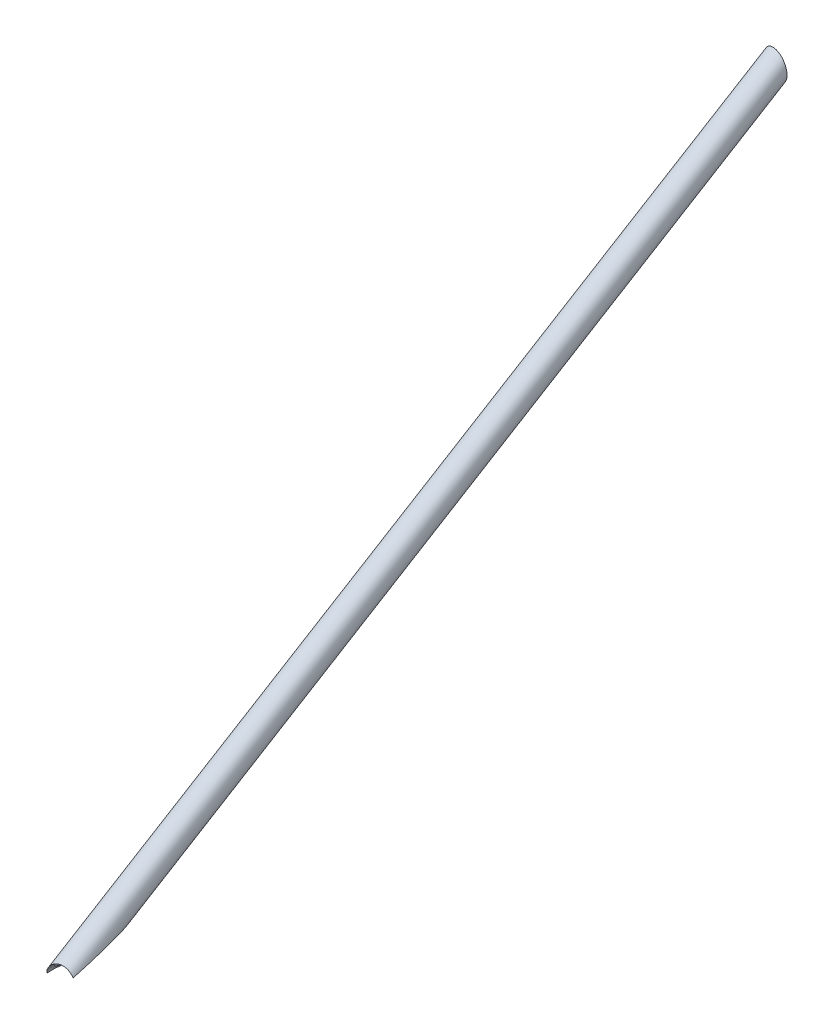
ISO-10303-21;
HEADER;
FILE_DESCRIPTION(('STEP AP214'),'2;1');
FILE_NAME('part.step','',(''),(''),'','','');
FILE_SCHEMA(('AUTOMOTIVE_DESIGN { 1 0 10303 214 1 1 1 1 }'));
ENDSEC;
DATA;
#1=APPLICATION_CONTEXT('core data for automotive mechanical design processes');
#2=APPLICATION_PROTOCOL_DEFINITION('international standard','automotive_design',2000,#1);
#3=PRODUCT_CONTEXT('',#1,'mechanical');
#4=PRODUCT('Part','Part','',(#3));
#5=PRODUCT_RELATED_PRODUCT_CATEGORY('part','',(#4));
#6=PRODUCT_DEFINITION_FORMATION('','',#4);
#7=PRODUCT_DEFINITION_CONTEXT('part definition',#1,'design');
#8=PRODUCT_DEFINITION('design','',#6,#7);
#9=PRODUCT_DEFINITION_SHAPE('','',#8);
#10=(LENGTH_UNIT() NAMED_UNIT(*) SI_UNIT(.MILLI.,.METRE.));
#11=(NAMED_UNIT(*) PLANE_ANGLE_UNIT() SI_UNIT($,.RADIAN.));
#12=(NAMED_UNIT(*) SI_UNIT($,.STERADIAN.) SOLID_ANGLE_UNIT());
#13=UNCERTAINTY_MEASURE_WITH_UNIT(LENGTH_MEASURE(1.E-05),#10,'distance_accuracy_value','');
#14=(GEOMETRIC_REPRESENTATION_CONTEXT(3) GLOBAL_UNCERTAINTY_ASSIGNED_CONTEXT((#13)) GLOBAL_UNIT_ASSIGNED_CONTEXT((#10,
#11,#12)) REPRESENTATION_CONTEXT('',''));
#15=CARTESIAN_POINT('',(0.,0.,0.));
#16=DIRECTION('',(0.,0.,1.));
#17=DIRECTION('',(1.,0.,0.));
#18=AXIS2_PLACEMENT_3D('',#15,#16,#17);
#19=CARTESIAN_POINT('',(150.,500.,-1140.));
#20=DIRECTION('',(0.0991899501072693,-0.396759800429077,0.912547540986877));
#21=DIRECTION('',(0.,-0.917070056253235,-0.39872611141445));
#22=AXIS2_PLACEMENT_3D('',#19,#20,#21);
#23=CYLINDRICAL_SURFACE('',#22,9.39999999999998);
#24=CARTESIAN_POINT('',(150.,500.,-1140.));
#25=DIRECTION('',(0.136924020573454,0.0230393226257371,-0.990313587810925));
#26=DIRECTION('',(0.508281006832032,-0.859722512143854,0.0502754433782237));
#27=AXIS2_PLACEMENT_3D('',#24,#25,#26);
#28=ELLIPSE('',#27,10.4529482704683,9.39999999999998);
#29=CARTESIAN_POINT('',(155.313035071277,491.013365053603,-1139.47447339109));
#30=VERTEX_POINT('',#29);
#31=EDGE_CURVE('E109',#30,#30,#28,.T.);
#32=ORIENTED_EDGE('',*,*,#31,.T.);
#33=EDGE_LOOP('',(#32));
#34=FACE_BOUND('',#33,.T.);
#35=CARTESIAN_POINT('',(220.064661909303,211.120893834006,-499.153135881705));
#36=CARTESIAN_POINT('',(220.099320079411,211.171386992194,-499.269269018708));
#37=CARTESIAN_POINT('',(220.134469333474,211.222149182262,-499.385137770033));
#38=CARTESIAN_POINT('',(220.205820504916,211.324244067555,-499.616300759155));
#39=CARTESIAN_POINT('',(220.242022438906,211.375576771776,-499.731594987853));
#40=CARTESIAN_POINT('',(220.352324937469,211.530493509359,-500.076574131023));
#41=CARTESIAN_POINT('',(220.428111647901,211.634980752581,-500.305319973177));
#42=CARTESIAN_POINT('',(220.584947604145,211.846759567912,-500.759972038414));
#43=CARTESIAN_POINT('',(220.666001544587,211.954053589355,-500.985875508033));
#44=CARTESIAN_POINT('',(220.834207488277,212.171729349294,-501.433871553911));
#45=CARTESIAN_POINT('',(220.92135872542,212.282110698835,-501.655964604585));
#46=CARTESIAN_POINT('',(221.102029020127,212.505311366507,-502.09305726484));
#47=CARTESIAN_POINT('',(221.195473215947,212.618093847434,-502.308106383438));
#48=CARTESIAN_POINT('',(221.391076842564,212.847785737646,-502.731946943887));
#49=CARTESIAN_POINT('',(221.493234757017,212.964694426829,-502.940739465986));
#50=CARTESIAN_POINT('',(221.708662818101,213.203666180425,-503.35009593615));
#51=CARTESIAN_POINT('',(221.821951727775,213.325737743401,-503.550645153088));
#52=CARTESIAN_POINT('',(222.062593133385,213.575818127842,-503.939146104218));
#53=CARTESIAN_POINT('',(222.189929152756,213.703819893327,-504.127112190407));
#54=CARTESIAN_POINT('',(222.395929897975,213.90205113745,-504.395402294217));
#55=CARTESIAN_POINT('',(222.46759295385,213.969609163335,-504.483060630941));
#56=CARTESIAN_POINT('',(222.616575584827,214.106697559118,-504.651734317474));
#57=CARTESIAN_POINT('',(222.693891782484,214.176226736399,-504.732753573389));
#58=CARTESIAN_POINT('',(222.854644965282,214.316910495059,-504.885584985316));
#59=CARTESIAN_POINT('',(222.938041633431,214.388052538127,-504.957450410004));
#60=CARTESIAN_POINT('',(223.112183975867,214.532098428571,-505.089399004768));
#61=CARTESIAN_POINT('',(223.202917028092,214.604999104741,-505.149501827237));
#62=CARTESIAN_POINT('',(223.380751717223,214.742915202468,-505.24737182625));
#63=CARTESIAN_POINT('',(223.466924635979,214.807796153569,-505.28697807314));
#64=CARTESIAN_POINT('',(223.645165882068,214.937366313044,-505.350345210875));
#65=CARTESIAN_POINT('',(223.737230611429,215.00205561367,-505.374115672899));
#66=CARTESIAN_POINT('',(223.926791003018,215.130086690554,-505.402385855141));
#67=CARTESIAN_POINT('',(224.024333113451,215.193407513742,-505.406683014352));
#68=CARTESIAN_POINT('',(224.220776672351,215.315427611468,-505.393311178749));
#69=CARTESIAN_POINT('',(224.319677064809,215.37413026129,-505.375658388106));
#70=CARTESIAN_POINT('',(224.504738725796,215.478918968777,-505.322395062764));
#71=CARTESIAN_POINT('',(224.591138344467,215.525682817421,-505.288888377496));
#72=CARTESIAN_POINT('',(224.760133247636,215.613211524775,-505.207575067726));
#73=CARTESIAN_POINT('',(224.842725294058,215.653971339849,-505.159756521744));
#74=CARTESIAN_POINT('',(225.047069682041,215.750314348958,-505.023403744513));
#75=CARTESIAN_POINT('',(225.165432621817,215.801753387983,-504.926928033842));
#76=CARTESIAN_POINT('',(225.390331010981,215.892664768235,-504.71621093246));
#77=CARTESIAN_POINT('',(225.496828882758,215.932099738527,-504.601915702968));
#78=CARTESIAN_POINT('',(225.696594209342,216.000524349176,-504.36520683162));
#79=CARTESIAN_POINT('',(225.790142050682,216.029768158182,-504.243097244514));
#80=CARTESIAN_POINT('',(225.969004569025,216.081189885288,-503.991502622916));
#81=CARTESIAN_POINT('',(226.054310664064,216.103360492328,-503.862010119095));
#82=CARTESIAN_POINT('',(226.218183105302,216.14209317163,-503.59765188341));
#83=CARTESIAN_POINT('',(226.296733287218,216.158642057603,-503.462774336563));
#84=CARTESIAN_POINT('',(226.447953132168,216.187123784577,-503.189412093623));
#85=CARTESIAN_POINT('',(226.5206256252,216.199058857633,-503.050929176419));
#86=CARTESIAN_POINT('',(226.716007742258,216.227016153202,-502.66179620998));
#87=CARTESIAN_POINT('',(226.833371638449,216.238928201088,-502.408172554985));
#88=CARTESIAN_POINT('',(227.056188274308,216.253920927869,-501.895435255878));
#89=CARTESIAN_POINT('',(227.161633393187,216.256995986795,-501.636318223656));
#90=CARTESIAN_POINT('',(227.36319475252,216.256303123197,-501.113909115738));
#91=CARTESIAN_POINT('',(227.459291366102,216.252521117826,-500.850609551166));
#92=CARTESIAN_POINT('',(227.643660986443,216.239478715106,-500.321413355495));
#93=CARTESIAN_POINT('',(227.731933064823,216.230217668668,-500.055516420363));
#94=CARTESIAN_POINT('',(227.902419455519,216.207138144898,-499.520238817643));
#95=CARTESIAN_POINT('',(227.984594287359,216.193292683817,-499.250846821768));
#96=CARTESIAN_POINT('',(228.143271419488,216.161805139958,-498.710612298831));
#97=CARTESIAN_POINT('',(228.219773417564,216.144162855104,-498.439769695312));
#98=CARTESIAN_POINT('',(228.367731976782,216.105680188694,-497.897393153289));
#99=CARTESIAN_POINT('',(228.439196141049,216.084844783911,-497.625860926399));
#100=CARTESIAN_POINT('',(228.577789296708,216.040398608003,-497.081933011295));
#101=CARTESIAN_POINT('',(228.644918428945,216.016787927119,-496.809537351435));
#102=CARTESIAN_POINT('',(228.788865859697,215.961987452383,-496.207360000409));
#103=CARTESIAN_POINT('',(228.864798364783,215.930242310439,-495.877417328371));
#104=CARTESIAN_POINT('',(229.011686568746,215.863716173058,-495.216728549147));
#105=CARTESIAN_POINT('',(229.08264212374,215.828935089916,-494.885982419019));
#106=CARTESIAN_POINT('',(229.288868650401,215.720642729472,-493.892709845382));
#107=CARTESIAN_POINT('',(229.417481594968,215.643189449449,-493.2292252314));
#108=CARTESIAN_POINT('',(229.660091347835,215.480125000602,-491.900247205637));
#109=CARTESIAN_POINT('',(229.774080027039,215.3945093403,-491.234752885282));
#110=CARTESIAN_POINT('',(229.989417484592,215.216835299838,-489.902569178675));
#111=CARTESIAN_POINT('',(230.090765859715,215.124776714295,-489.235879754987));
#112=CARTESIAN_POINT('',(230.282597688606,214.935191205951,-487.899307571728));
#113=CARTESIAN_POINT('',(230.373042031195,214.837646337381,-487.22942178249));
#114=CARTESIAN_POINT('',(230.543670517482,214.638446966581,-485.888950856504));
#115=CARTESIAN_POINT('',(230.623854513367,214.536792405174,-485.218365709821));
#116=CARTESIAN_POINT('',(230.774613905371,214.330338362139,-483.876888975044));
#117=CARTESIAN_POINT('',(230.845193231446,214.225540188338,-483.205997625666));
#118=CARTESIAN_POINT('',(230.977192865644,214.013603749743,-481.863690341685));
#119=CARTESIAN_POINT('',(231.038613231726,213.906465499762,-481.192274410429));
#120=CARTESIAN_POINT('',(231.152213257609,213.691142311586,-479.851847151599));
#121=CARTESIAN_POINT('',(231.204431959075,213.582963955358,-479.18283807156));
#122=CARTESIAN_POINT('',(231.299874457506,213.365949510461,-477.844279431712));
#123=CARTESIAN_POINT('',(231.343098187854,213.257113416925,-477.174729867936));
#124=CARTESIAN_POINT('',(231.420216514265,213.039664802256,-475.834722961952));
#125=CARTESIAN_POINT('',(231.454106609656,212.931052413958,-475.164265337916));
#126=CARTESIAN_POINT('',(231.511839622914,212.715193816297,-473.822706268846));
#127=CARTESIAN_POINT('',(231.535682733467,212.607947580772,-473.151604836408));
#128=CARTESIAN_POINT('',(231.572122617046,212.396501726966,-471.810903686558));
#129=CARTESIAN_POINT('',(231.584756671338,212.292293132642,-471.141306435786));
#130=CARTESIAN_POINT('',(231.597140949471,212.088225733161,-469.801259520993));
#131=CARTESIAN_POINT('',(231.596890069008,211.988367301568,-469.130809788834));
#132=CARTESIAN_POINT('',(231.580797535177,211.795294638263,-467.789600387438));
#133=CARTESIAN_POINT('',(231.564967605842,211.702075466737,-467.118841330385));
#134=CARTESIAN_POINT('',(231.526290906026,211.569490092793,-466.112382842278));
#135=CARTESIAN_POINT('',(231.510911837949,211.526505299738,-465.776869806133));
#136=CARTESIAN_POINT('',(231.474392711313,211.443450540988,-465.105801165664));
#137=CARTESIAN_POINT('',(231.453252918551,211.403380440919,-464.770245564018));
#138=CARTESIAN_POINT('',(231.41311622617,211.340604505092,-464.220646074328));
#139=CARTESIAN_POINT('',(231.396112415219,211.316862489423,-464.006574330762));
#140=CARTESIAN_POINT('',(231.359053707262,211.270977416602,-463.578515270828));
#141=CARTESIAN_POINT('',(231.33899872175,211.24883440586,-463.364527957089));
#142=CARTESIAN_POINT('',(231.295473104098,211.206334812159,-462.936646709144));
#143=CARTESIAN_POINT('',(231.272001358971,211.185978814786,-462.722752828233));
#144=CARTESIAN_POINT('',(231.221217559821,211.147279864333,-462.295247806794));
#145=CARTESIAN_POINT('',(231.193905532552,211.12893689723,-462.081636664307));
#146=CARTESIAN_POINT('',(231.105544738564,211.077308057867,-461.44176975567));
#147=CARTESIAN_POINT('',(231.038031224977,211.047380535472,-461.016068980392));
#148=CARTESIAN_POINT('',(230.920039078621,211.010843178151,-460.380212588652));
#149=CARTESIAN_POINT('',(230.877926284418,211.000057021985,-460.168729990335));
#150=CARTESIAN_POINT('',(230.78729816995,210.981561470591,-459.747011402418));
#151=CARTESIAN_POINT('',(230.738783318896,210.973851850049,-459.536775322639));
#152=CARTESIAN_POINT('',(230.617738344714,210.9598717397,-459.051000508472));
#153=CARTESIAN_POINT('',(230.542490946606,210.954850957142,-458.776090060045));
#154=CARTESIAN_POINT('',(230.376783614666,210.951282372816,-458.230773733188));
#155=CARTESIAN_POINT('',(230.286322918862,210.952734895362,-457.960368081131));
#156=CARTESIAN_POINT('',(230.087612265618,210.962482105406,-457.426789008479));
#157=CARTESIAN_POINT('',(229.979395518191,210.970764133602,-457.163603137062));
#158=CARTESIAN_POINT('',(229.742255500559,210.994068453765,-456.647013248077));
#159=CARTESIAN_POINT('',(229.613339859437,211.009088266003,-456.393605668999));
#160=CARTESIAN_POINT('',(229.365545058329,211.040730149745,-455.958484480011));
#161=CARTESIAN_POINT('',(229.251462745636,211.056140047502,-455.773951098269));
#162=CARTESIAN_POINT('',(229.009159965764,211.089534375582,-455.414679908005));
#163=CARTESIAN_POINT('',(228.880943476457,211.107518081964,-455.239939364197));
#164=CARTESIAN_POINT('',(228.610281960249,211.144842421159,-454.902171972233));
#165=CARTESIAN_POINT('',(228.467846731657,211.164182116845,-454.73913718888));
#166=CARTESIAN_POINT('',(228.169121756591,211.202668765541,-454.426248411849));
#167=CARTESIAN_POINT('',(228.01283182125,211.22181571592,-454.276394597908));
#168=CARTESIAN_POINT('',(227.68708865441,211.258165292007,-453.990734735451));
#169=CARTESIAN_POINT('',(227.517607699365,211.275363625393,-453.854959752818));
#170=CARTESIAN_POINT('',(227.16728843825,211.305898497926,-453.59846677969));
#171=CARTESIAN_POINT('',(226.986449759605,211.319234910307,-453.477749283525));
#172=CARTESIAN_POINT('',(226.615020684811,211.340276970188,-453.251377094262));
#173=CARTESIAN_POINT('',(226.424420153028,211.347976632884,-453.145738506647));
#174=CARTESIAN_POINT('',(226.03554918605,211.356141609917,-452.949377802037));
#175=CARTESIAN_POINT('',(225.837278631041,211.356606811201,-452.858655918169));
#176=CARTESIAN_POINT('',(225.438602504848,211.34905427098,-452.693071276195));
#177=CARTESIAN_POINT('',(225.238300549693,211.341189933625,-452.617951166598));
#178=CARTESIAN_POINT('',(224.833826409559,211.316227188696,-452.480864695171));
#179=CARTESIAN_POINT('',(224.629654328121,211.299129027823,-452.418897981982));
#180=CARTESIAN_POINT('',(224.219022260803,211.254950604197,-452.307397896566));
#181=CARTESIAN_POINT('',(224.012562331068,211.22787058588,-452.257864219929));
#182=CARTESIAN_POINT('',(223.598801927162,211.163197360555,-452.170524828764));
#183=CARTESIAN_POINT('',(223.391501376731,211.125603177693,-452.132720203534));
#184=CARTESIAN_POINT('',(222.953260696112,211.034537141052,-452.064431881472));
#185=CARTESIAN_POINT('',(222.722384206995,210.979724590582,-452.035316856703));
#186=CARTESIAN_POINT('',(222.26304300168,210.856335071658,-451.990120294816));
#187=CARTESIAN_POINT('',(222.03457844215,210.787757214789,-451.974039599273));
#188=CARTESIAN_POINT('',(221.581616510668,210.636817586406,-451.954242663206));
#189=CARTESIAN_POINT('',(221.357120529378,210.554451084954,-451.950530674703));
#190=CARTESIAN_POINT('',(220.913699632089,210.376161838986,-451.954939408495));
#191=CARTESIAN_POINT('',(220.694774802113,210.2802388853,-451.963060313386));
#192=CARTESIAN_POINT('',(220.250598920795,210.068892451358,-451.991566726532));
#193=CARTESIAN_POINT('',(220.025792716788,209.952630308874,-452.012678998487));
#194=CARTESIAN_POINT('',(219.585657806908,209.705954600834,-452.067404053287));
#195=CARTESIAN_POINT('',(219.370329530063,209.575540395595,-452.101017401355));
#196=CARTESIAN_POINT('',(218.950617116605,209.301455101391,-452.180531193165));
#197=CARTESIAN_POINT('',(218.746234355769,209.15778235207,-452.226433177174));
#198=CARTESIAN_POINT('',(218.34982429809,208.858322847319,-452.330447697385));
#199=CARTESIAN_POINT('',(218.157796961659,208.702536130708,-452.388560194462));
#200=CARTESIAN_POINT('',(217.785043860791,208.378182117622,-452.517875013928));
#201=CARTESIAN_POINT('',(217.604489592498,208.209479282991,-452.58923203962));
#202=CARTESIAN_POINT('',(217.258534120651,207.862698377056,-452.744779229215));
#203=CARTESIAN_POINT('',(217.093133214939,207.684620121586,-452.828969645275));
#204=CARTESIAN_POINT('',(216.77849213957,207.320986074619,-453.010612641877));
#205=CARTESIAN_POINT('',(216.629256750554,207.135428093279,-453.108069126479));
#206=CARTESIAN_POINT('',(216.347894454245,206.759166684426,-453.316788581306));
#207=CARTESIAN_POINT('',(216.215767114946,206.56846338699,-453.428051202764));
#208=CARTESIAN_POINT('',(215.97190328069,206.188615087705,-453.662586497315));
#209=CARTESIAN_POINT('',(215.859795997847,205.999521831356,-453.785556938083));
#210=CARTESIAN_POINT('',(215.653040121406,205.621839978951,-454.046128984758));
#211=CARTESIAN_POINT('',(215.558391508849,205.433251382347,-454.183730574775));
#212=CARTESIAN_POINT('',(215.386763519102,205.060116710873,-454.47405522889));
#213=CARTESIAN_POINT('',(215.309761528495,204.875565739551,-454.626758577192));
#214=CARTESIAN_POINT('',(215.172972085674,204.513898577503,-454.947878932037));
#215=CARTESIAN_POINT('',(215.113182260252,204.336781364693,-455.116293768042));
#216=CARTESIAN_POINT('',(215.014694820781,204.009393689018,-455.452745438566));
#217=CARTESIAN_POINT('',(214.974571214855,203.858147793311,-455.61941691787));
#218=CARTESIAN_POINT('',(214.906830701179,203.567601823792,-455.965227598877));
#219=CARTESIAN_POINT('',(214.879212230252,203.428300258671,-456.144365239044));
#220=CARTESIAN_POINT('',(214.83510074869,203.163976691281,-456.513968445678));
#221=CARTESIAN_POINT('',(214.8185997116,203.03894444128,-456.704425731357));
#222=CARTESIAN_POINT('',(214.795023719013,202.804555880382,-457.095302040104));
#223=CARTESIAN_POINT('',(214.787949778719,202.69520125894,-457.295722133656));
#224=CARTESIAN_POINT('',(214.78096882043,202.477894571847,-457.734937828598));
#225=CARTESIAN_POINT('',(214.782273489882,202.372530945495,-457.975031937996));
#226=CARTESIAN_POINT('',(214.792373077148,202.182941350875,-458.463237998898));
#227=CARTESIAN_POINT('',(214.80116968307,202.098720152027,-458.711351745292));
#228=CARTESIAN_POINT('',(214.824066991089,201.949779578127,-459.213624867991));
#229=CARTESIAN_POINT('',(214.838178864499,201.885101797894,-459.46779591382));
#230=CARTESIAN_POINT('',(214.869968328429,201.773400180831,-459.979687343478));
#231=CARTESIAN_POINT('',(214.887645793773,201.726375724413,-460.237407602409));
#232=CARTESIAN_POINT('',(214.929307625403,201.639314063704,-460.810185484482));
#233=CARTESIAN_POINT('',(214.953832984135,201.602906703095,-461.125747704369));
#234=CARTESIAN_POINT('',(215.004747865138,201.548893197252,-461.758385196482));
#235=CARTESIAN_POINT('',(215.031138251059,201.531295824107,-462.075461105446));
#236=CARTESIAN_POINT('',(215.084915183706,201.511603268663,-462.710531104506));
#237=CARTESIAN_POINT('',(215.112303414128,201.509535635027,-463.028525825694));
#238=CARTESIAN_POINT('',(215.167502032956,201.518239851795,-463.66422183788));
#239=CARTESIAN_POINT('',(215.195312359267,201.529009831317,-463.981923164883));
#240=CARTESIAN_POINT('',(215.251328639284,201.561329943732,-464.619576181588));
#241=CARTESIAN_POINT('',(215.27953591167,201.582975118775,-464.939522749863));
#242=CARTESIAN_POINT('',(215.335969316492,201.635294435145,-465.578668793592));
#243=CARTESIAN_POINT('',(215.364195449423,201.665968823804,-465.89786824834));
#244=CARTESIAN_POINT('',(215.420592923757,201.734875168563,-466.535053727828));
#245=CARTESIAN_POINT('',(215.448764290221,201.773097986414,-466.853040750499));
#246=CARTESIAN_POINT('',(215.505100642529,201.855987753879,-467.488157650936));
#247=CARTESIAN_POINT('',(215.533265628535,201.900654514243,-467.805287553595));
#248=CARTESIAN_POINT('',(215.591450859649,201.998573369787,-468.459102035368));
#249=CARTESIAN_POINT('',(215.621473805369,202.052193059809,-468.795731071354));
#250=CARTESIAN_POINT('',(215.681642492365,202.164824500881,-469.468077341597));
#251=CARTESIAN_POINT('',(215.7117882366,202.223836382588,-469.803794553556));
#252=CARTESIAN_POINT('',(215.802546380383,202.407879082882,-470.80971166712));
#253=CARTESIAN_POINT('',(215.863473419714,202.539906021243,-471.478606195425));
#254=CARTESIAN_POINT('',(215.986923719661,202.818511155248,-472.81351637535));
#255=CARTESIAN_POINT('',(216.04944774851,202.965096455996,-473.479530454078));
#256=CARTESIAN_POINT('',(216.176784106079,203.270044229773,-474.80864672421));
#257=CARTESIAN_POINT('',(216.241596493406,203.428407004546,-475.471748840546));
#258=CARTESIAN_POINT('',(216.374402997432,203.755544282792,-476.797299523012));
#259=CARTESIAN_POINT('',(216.442406533958,203.924350149274,-477.459739380149));
#260=CARTESIAN_POINT('',(216.582079044734,204.270626469708,-478.781968850347));
#261=CARTESIAN_POINT('',(216.653748066711,204.448097036475,-479.44175842878));
#262=CARTESIAN_POINT('',(216.80139973848,204.810751731018,-480.758448487737));
#263=CARTESIAN_POINT('',(216.877380695244,204.995932823848,-481.415349994553));
#264=CARTESIAN_POINT('',(217.034390232075,205.37350510288,-482.726468238436));
#265=CARTESIAN_POINT('',(217.115418780951,205.565896244527,-483.380684992067));
#266=CARTESIAN_POINT('',(217.282591103395,205.95591803594,-484.680807029246));
#267=CARTESIAN_POINT('',(217.36868604866,206.153490911568,-485.326735908129));
#268=CARTESIAN_POINT('',(217.547458635215,206.555300578395,-486.615612794012));
#269=CARTESIAN_POINT('',(217.640136332837,206.759537426611,-487.258560775454));
#270=CARTESIAN_POINT('',(217.833136525816,207.174863126901,-488.541481232462));
#271=CARTESIAN_POINT('',(217.933463086451,207.385955587954,-489.181451931213));
#272=CARTESIAN_POINT('',(218.142955215508,207.815161351463,-490.457572555616));
#273=CARTESIAN_POINT('',(218.252120579795,208.033274491703,-491.093722569143));
#274=CARTESIAN_POINT('',(218.480472918303,208.476270546806,-492.359336593806));
#275=CARTESIAN_POINT('',(218.599624043757,208.701127529151,-492.988816094516));
#276=CARTESIAN_POINT('',(218.850332419134,209.159113098532,-494.242252951715));
#277=CARTESIAN_POINT('',(218.981889087723,209.392241297653,-494.866210565467));
#278=CARTESIAN_POINT('',(219.260141928297,209.867806061118,-496.10664482346));
#279=CARTESIAN_POINT('',(219.406826070116,210.110235134018,-496.723126983116));
#280=CARTESIAN_POINT('',(219.641428100326,210.482360499121,-497.640599741287));
#281=CARTESIAN_POINT('',(219.722050010098,210.607804008559,-497.945187951924));
#282=CARTESIAN_POINT('',(219.88891017863,210.861864870834,-498.551483835761));
#283=CARTESIAN_POINT('',(219.975148117508,210.990482042643,-498.853191671902));
#284=CARTESIAN_POINT('',(220.064661909303,211.120893834006,-499.153135881705));
#285=B_SPLINE_CURVE_WITH_KNOTS('',3,(#35,#36,#37,#38,#39,#40,#41,#42,#43,#44,#45,#46,#47,#48,
#49,#50,#51,#52,#53,#54,#55,#56,#57,#58,#59,#60,#61,#62,#63,#64,#65,#66,#67,#68,#69,#70,#71,#72,
#73,#74,#75,#76,#77,#78,#79,#80,#81,#82,#83,#84,#85,#86,#87,#88,#89,#90,#91,#92,#93,#94,#95,#96,
#97,#98,#99,#100,#101,#102,#103,#104,#105,#106,#107,#108,#109,#110,#111,#112,#113,#114,#115,
#116,#117,#118,#119,#120,#121,#122,#123,#124,#125,#126,#127,#128,#129,#130,#131,#132,#133,#134,
#135,#136,#137,#138,#139,#140,#141,#142,#143,#144,#145,#146,#147,#148,#149,#150,#151,#152,#153,
#154,#155,#156,#157,#158,#159,#160,#161,#162,#163,#164,#165,#166,#167,#168,#169,#170,#171,#172,
#173,#174,#175,#176,#177,#178,#179,#180,#181,#182,#183,#184,#185,#186,#187,#188,#189,#190,#191,
#192,#193,#194,#195,#196,#197,#198,#199,#200,#201,#202,#203,#204,#205,#206,#207,#208,#209,#210,
#211,#212,#213,#214,#215,#216,#217,#218,#219,#220,#221,#222,#223,#224,#225,#226,#227,#228,#229,
#230,#231,#232,#233,#234,#235,#236,#237,#238,#239,#240,#241,#242,#243,#244,#245,#246,#247,#248,
#249,#250,#251,#252,#253,#254,#255,#256,#257,#258,#259,#260,#261,#262,#263,#264,#265,#266,#267,
#268,#269,#270,#271,#272,#273,#274,#275,#276,#277,#278,#279,#280,#281,#282,#283,#284),
.UNSPECIFIED.,.T.,.F.,(4,2,2,2,2,2,2,2,2,2,2,2,2,2,2,2,2,2,2,2,2,2,2,2,2,2,2,2,2,2,2,2,2,2,2,2,
2,2,2,2,2,2,2,2,2,2,2,2,2,2,2,2,2,2,2,2,2,2,2,2,2,2,2,2,2,2,2,2,2,2,2,2,2,2,2,2,2,2,2,2,2,2,2,2,
2,2,2,2,2,2,2,2,2,2,2,2,2,2,2,2,2,2,2,2,2,2,2,2,2,2,2,2,2,2,2,2,2,2,2,2,2,2,2,2,4),(0.,
0.393873326312979,0.78775287072041,1.5756323582207,2.3642239708645,3.15271667676276,
3.93308526901834,4.71331833916357,5.49488994654371,6.27555436547403,6.67086711556824,
7.06594558781482,7.45860830756822,7.85060927713262,8.19433791383499,8.53785861133015,
8.88494452479287,9.23177436015038,9.54180856043684,9.85210173488161,10.3327162194007,
10.8148119956147,11.2838393990208,11.7533500431564,12.2239544860033,12.6943309757615,
13.5327915509405,14.3717852353949,15.2125039739192,16.0533223302614,16.8991804080948,
17.7450835156438,18.5896813671593,19.4342517635799,20.4543475334737,21.4744727820104,
23.5149584074458,25.5565733951445,27.5982534938782,29.6470516761195,31.6958793704427,
33.7438662060347,35.7918400811976,37.8309036657094,39.8699823510715,41.9100425644587,
43.9500636509232,45.9832739222339,48.0166584502427,50.0485139212034,51.0642816289717,
52.080002477839,52.7281425198197,53.376301366463,54.0246718212005,54.6730377590402,
55.9685237823942,56.6161410417578,57.2637108632699,58.1184746037202,58.9732811685107,
59.8265067997256,60.679418672693,61.3312890769122,61.9829764871376,62.6342178715913,
63.2854681351055,63.9381261429105,64.5908055715573,65.2441769799307,65.8975585986308,
66.5391128299969,67.1806499217286,67.8221713045717,68.4637522488904,69.1801843349744,
69.8966626745688,70.613387294217,71.3301229738901,72.0911419009641,72.852195240912,
73.6133440165881,74.3744903532944,75.1451615218961,75.9158478349377,76.6867614449439,
77.4576555842959,78.2123168613636,78.9669773188528,79.7206652341197,80.4742491813373,
81.1591299054388,81.8439249938671,82.5282251493388,83.2125989910845,83.9979670785419,
84.7835121746003,85.5707175798765,86.3578953535222,87.3129780381166,88.2685059340689,
89.2257284695973,90.1828115218762,91.1484082634717,92.1140314576342,93.0784927409307,
94.0429257049892,95.0694505911215,96.0960003572457,98.1493156973542,100.20363811421,
102.258013181998,104.318889526926,106.379792712115,108.439892233265,110.49997902582,
112.542715602178,114.585469661048,116.629317090701,118.673117330422,120.709871225838,
122.746529724756,124.781580875273,125.79891968419,126.816200597041),.UNSPECIFIED.);
#286=CARTESIAN_POINT('',(215.191128345142,201.52898822881,-463.933703285777));
#287=VERTEX_POINT('',#286);
#288=CARTESIAN_POINT('',(214.860041456088,203.313279484272,-456.30528613603));
#289=VERTEX_POINT('',#288);
#290=EDGE_CURVE('E100',#287,#289,#285,.T.);
#291=ORIENTED_EDGE('',*,*,#290,.T.);
#292=CARTESIAN_POINT('',(222.869770330286,199.900460150074,-473.346138408661));
#293=CARTESIAN_POINT('',(223.043197256451,199.888794231383,-473.319303082066));
#294=CARTESIAN_POINT('',(223.215266278485,199.878082194416,-473.283118534989));
#295=CARTESIAN_POINT('',(223.555101943853,199.858547691879,-473.194054844745));
#296=CARTESIAN_POINT('',(223.722866602064,199.849726084836,-473.141168143237));
#297=CARTESIAN_POINT('',(224.21903499775,199.825946772203,-472.96035559313));
#298=CARTESIAN_POINT('',(224.539660154079,199.813717509497,-472.810392377962));
#299=CARTESIAN_POINT('',(225.077055801907,199.798014415387,-472.511862481363));
#300=CARTESIAN_POINT('',(225.299350032425,199.793098577081,-472.372829310339));
#301=CARTESIAN_POINT('',(225.731215059089,199.786451143273,-472.075921615311));
#302=CARTESIAN_POINT('',(225.940778292584,199.78472142289,-471.918036054311));
#303=CARTESIAN_POINT('',(226.347820794038,199.784168962673,-471.587252072828));
#304=CARTESIAN_POINT('',(226.545291033816,199.785348368212,-471.414342663526));
#305=CARTESIAN_POINT('',(226.929002117911,199.790401291305,-471.056443198993));
#306=CARTESIAN_POINT('',(227.115238725594,199.794275818476,-470.871448640102));
#307=CARTESIAN_POINT('',(227.471288175255,199.804400977266,-470.497973580603));
#308=CARTESIAN_POINT('',(227.641441140615,199.810568365892,-470.309813234843));
#309=CARTESIAN_POINT('',(227.972767291348,199.825204233668,-469.925905023184));
#310=CARTESIAN_POINT('',(228.133941725032,199.833672391968,-469.730158218499));
#311=CARTESIAN_POINT('',(228.448166619463,199.8528890305,-469.332085401038));
#312=CARTESIAN_POINT('',(228.601209539734,199.863639582631,-469.129753552788));
#313=CARTESIAN_POINT('',(228.899624309433,199.887436575774,-468.719628398912));
#314=CARTESIAN_POINT('',(229.044995254571,199.90048328665,-468.511834453779));
#315=CARTESIAN_POINT('',(229.471629539806,199.943272516801,-467.879648716308));
#316=CARTESIAN_POINT('',(229.742081805261,199.976582956569,-467.44816691777));
#317=CARTESIAN_POINT('',(230.257396502948,200.053722411547,-466.571526163158));
#318=CARTESIAN_POINT('',(230.502272401873,200.097545850876,-466.126374566036));
#319=CARTESIAN_POINT('',(230.868398543792,200.176196413967,-465.419618775428));
#320=CARTESIAN_POINT('',(230.997463708149,200.206767062964,-465.16155017382));
#321=CARTESIAN_POINT('',(231.248405215001,200.272570502711,-464.642510423274));
#322=CARTESIAN_POINT('',(231.370281355133,200.30780342461,-464.381539192876));
#323=CARTESIAN_POINT('',(231.607165006083,200.3837068132,-463.856920900489));
#324=CARTESIAN_POINT('',(231.722164650177,200.424383341485,-463.593271162791));
#325=CARTESIAN_POINT('',(231.945214749553,200.512117027768,-463.064104864916));
#326=CARTESIAN_POINT('',(232.053265488186,200.559173925355,-462.798588381349));
#327=CARTESIAN_POINT('',(232.261784364059,200.660679153311,-462.267672217639));
#328=CARTESIAN_POINT('',(232.362289962208,200.715086608999,-462.002279506696));
#329=CARTESIAN_POINT('',(232.556091545927,200.833158461266,-461.470838039431));
#330=CARTESIAN_POINT('',(232.649386236165,200.896824515121,-461.204789174057));
#331=CARTESIAN_POINT('',(232.82800280009,201.035467230914,-460.673521647444));
#332=CARTESIAN_POINT('',(232.913339441162,201.110422239838,-460.408302368215));
#333=CARTESIAN_POINT('',(233.07520743131,201.274544146832,-459.87963863361));
#334=CARTESIAN_POINT('',(233.151743276293,201.363703732427,-459.616193337333));
#335=CARTESIAN_POINT('',(233.273916417366,201.53173959049,-459.16808586885));
#336=CARTESIAN_POINT('',(233.322121762959,201.606236844509,-458.982488488041));
#337=CARTESIAN_POINT('',(233.412318089607,201.765853406859,-458.614297613451));
#338=CARTESIAN_POINT('',(233.454308458714,201.850973759659,-458.431704417041));
#339=CARTESIAN_POINT('',(233.530759643676,202.03312963439,-458.071579032993));
#340=CARTESIAN_POINT('',(233.565242317275,202.130129247083,-457.894033498387));
#341=CARTESIAN_POINT('',(233.62532042884,202.33762202432,-457.545416977767));
#342=CARTESIAN_POINT('',(233.650918915761,202.448110541988,-457.374343788509));
#343=CARTESIAN_POINT('',(233.687111847042,202.657996915328,-457.076950695462));
#344=CARTESIAN_POINT('',(233.699751933314,202.754643818138,-456.948938981187));
#345=CARTESIAN_POINT('',(233.717633076207,202.956689464665,-456.69948918185));
#346=CARTESIAN_POINT('',(233.722876092287,203.062085882828,-456.578049364115));
#347=CARTESIAN_POINT('',(233.725188061127,203.281110127631,-456.342814049441));
#348=CARTESIAN_POINT('',(233.722259876844,203.394735057644,-456.22901588939));
#349=CARTESIAN_POINT('',(233.707640168746,203.629269788208,-456.009787336358));
#350=CARTESIAN_POINT('',(233.695948337669,203.750179844046,-455.904357236913));
#351=CARTESIAN_POINT('',(233.663486703309,203.997676723508,-455.702437904128));
#352=CARTESIAN_POINT('',(233.642734867668,204.124251868585,-455.605931430322));
#353=CARTESIAN_POINT('',(233.592066768621,204.381758826693,-455.421553327946));
#354=CARTESIAN_POINT('',(233.562150394911,204.512690692146,-455.333681803323));
#355=CARTESIAN_POINT('',(233.493214424565,204.777572730037,-455.165998255831));
#356=CARTESIAN_POINT('',(233.454180405794,204.911527377403,-455.086199291606));
#357=CARTESIAN_POINT('',(233.367286617698,205.180845287928,-454.934111028667));
#358=CARTESIAN_POINT('',(233.319424444456,205.31620892526,-454.861823783806));
#359=CARTESIAN_POINT('',(233.192606514899,205.645788147981,-454.694062541567));
#360=CARTESIAN_POINT('',(233.109164961117,205.840084381942,-454.602117305522));
#361=CARTESIAN_POINT('',(232.925862660368,206.225939775653,-454.429517963685));
#362=CARTESIAN_POINT('',(232.825995261328,206.41749779219,-454.348868456993));
#363=CARTESIAN_POINT('',(232.610760450176,206.795700321906,-454.196556376351));
#364=CARTESIAN_POINT('',(232.495375566152,206.982339008671,-454.124904111297));
#365=CARTESIAN_POINT('',(232.250160455259,207.34856793045,-453.988821134836));
#366=CARTESIAN_POINT('',(232.120331771401,207.528158915594,-453.924389653517));
#367=CARTESIAN_POINT('',(231.843425309082,207.883470219599,-453.799565257063));
#368=CARTESIAN_POINT('',(231.695977550147,208.058956562351,-453.739327547915));
#369=CARTESIAN_POINT('',(231.387689094081,208.399403664087,-453.623575703284));
#370=CARTESIAN_POINT('',(231.226848198876,208.564364267341,-453.568061637686));
#371=CARTESIAN_POINT('',(230.892750520391,208.882387737677,-453.46079591654));
#372=CARTESIAN_POINT('',(230.71949822338,209.03545486253,-453.409042914994));
#373=CARTESIAN_POINT('',(230.361477157756,209.328556065739,-453.308543992926));
#374=CARTESIAN_POINT('',(230.176708082577,209.468589796912,-453.25979815252));
#375=CARTESIAN_POINT('',(229.771403702503,209.752183691393,-453.158463440595));
#376=CARTESIAN_POINT('',(229.5493765781,209.893744126729,-453.106223462693));
#377=CARTESIAN_POINT('',(229.093381357451,210.157268345337,-453.004380423546));
#378=CARTESIAN_POINT('',(228.859412220303,210.279230416501,-452.954777592934));
#379=CARTESIAN_POINT('',(228.381202872929,210.502289067671,-452.857895140683));
#380=CARTESIAN_POINT('',(228.136960714123,210.603381667488,-452.810615963514));
#381=CARTESIAN_POINT('',(227.640099578553,210.783586570714,-452.718265903448));
#382=CARTESIAN_POINT('',(227.387481020432,210.862699970776,-452.673194910467));
#383=CARTESIAN_POINT('',(226.88328493662,210.996133767051,-452.586568639402));
#384=CARTESIAN_POINT('',(226.631891822714,211.051109805569,-452.544949169438));
#385=CARTESIAN_POINT('',(226.124923736124,211.13902241457,-452.463959133391));
#386=CARTESIAN_POINT('',(225.869348820002,211.171959282894,-452.424588536922));
#387=CARTESIAN_POINT('',(225.355986190041,211.215506480558,-452.348353003802));
#388=CARTESIAN_POINT('',(225.098198920365,211.226121190787,-452.311487576867));
#389=CARTESIAN_POINT('',(224.58228524527,211.225013715628,-452.240600551935));
#390=CARTESIAN_POINT('',(224.32415884392,211.213291795911,-452.206578920119));
#391=CARTESIAN_POINT('',(223.815752284245,211.168303807805,-452.142613055387));
#392=CARTESIAN_POINT('',(223.565434603633,211.135571546368,-452.11258946336));
#393=CARTESIAN_POINT('',(223.067958545215,211.049515784115,-452.056167696911));
#394=CARTESIAN_POINT('',(222.820800110091,210.996192657441,-452.029769456626));
#395=CARTESIAN_POINT('',(222.331206296154,210.869593083466,-451.981191830414));
#396=CARTESIAN_POINT('',(222.088771356466,210.796314790406,-451.959012835069));
#397=CARTESIAN_POINT('',(221.61011916448,210.630633083273,-451.919587553826));
#398=CARTESIAN_POINT('',(221.373902006432,210.538229379483,-451.902341342659));
#399=CARTESIAN_POINT('',(220.90361542046,210.332918829008,-451.873300060721));
#400=CARTESIAN_POINT('',(220.669724194807,210.219584522375,-451.861641326384));
#401=CARTESIAN_POINT('',(220.211155150835,209.975135047042,-451.845493803324));
#402=CARTESIAN_POINT('',(219.98647788793,209.844018808501,-451.841005446211));
#403=CARTESIAN_POINT('',(219.547417209551,209.565326873876,-451.840576310221));
#404=CARTESIAN_POINT('',(219.333038768149,209.417743336587,-451.844639619966));
#405=CARTESIAN_POINT('',(218.915770997251,209.107747492797,-451.863048126054));
#406=CARTESIAN_POINT('',(218.712880163886,208.945337134614,-451.877391973174));
#407=CARTESIAN_POINT('',(218.346472586737,208.630629268052,-451.915732287149));
#408=CARTESIAN_POINT('',(218.181365625337,208.479986027476,-451.938140506411));
#409=CARTESIAN_POINT('',(217.861073901928,208.170429496536,-451.993994786272));
#410=CARTESIAN_POINT('',(217.705887669193,208.011517438373,-452.027439206225));
#411=CARTESIAN_POINT('',(217.406260756838,207.687342826513,-452.107405819179));
#412=CARTESIAN_POINT('',(217.261806731512,207.522088561085,-452.153911414115));
#413=CARTESIAN_POINT('',(216.984165543006,207.187257658273,-452.262425315205));
#414=CARTESIAN_POINT('',(216.850974521681,207.017682527117,-452.324428283705));
#415=CARTESIAN_POINT('',(216.629479229512,206.721041962936,-452.448133228574));
#416=CARTESIAN_POINT('',(216.538463911264,206.594304186768,-452.505780371571));
#417=CARTESIAN_POINT('',(216.363405113116,206.341454277928,-452.631959183821));
#418=CARTESIAN_POINT('',(216.279359522272,206.215341966778,-452.700487538984));
#419=CARTESIAN_POINT('',(216.118693538689,205.965565104396,-452.849035098146));
#420=CARTESIAN_POINT('',(216.042059337037,205.841896356454,-452.929032214801));
#421=CARTESIAN_POINT('',(215.896287477623,205.598469568412,-453.100949718431));
#422=CARTESIAN_POINT('',(215.827149659305,205.478711444593,-453.192869849948));
#423=CARTESIAN_POINT('',(215.696236272089,205.244292316397,-453.388805824987));
#424=CARTESIAN_POINT('',(215.634489624532,205.129652369595,-453.492866227494));
#425=CARTESIAN_POINT('',(215.518583359014,204.907310703746,-453.712020837795));
#426=CARTESIAN_POINT('',(215.464423700705,204.799608947803,-453.827114986906));
#427=CARTESIAN_POINT('',(215.363336462683,204.591902867202,-454.067232598424));
#428=CARTESIAN_POINT('',(215.31641694944,204.491907189311,-454.192266903892));
#429=CARTESIAN_POINT('',(215.229392336084,204.300053283841,-454.450694930723));
#430=CARTESIAN_POINT('',(215.189289681301,204.208197981995,-454.584091628438));
#431=CARTESIAN_POINT('',(215.098818647598,203.993313691534,-454.918782673558));
#432=CARTESIAN_POINT('',(215.051855021387,203.874665079609,-455.123812200478));
#433=CARTESIAN_POINT('',(214.969147652076,203.652599936488,-455.544109047961));
#434=CARTESIAN_POINT('',(214.933410692806,203.549192634964,-455.759382468394));
#435=CARTESIAN_POINT('',(214.871439976397,203.355117150029,-456.197770376688));
#436=CARTESIAN_POINT('',(214.845240238523,203.264495262422,-456.420909878929));
#437=CARTESIAN_POINT('',(214.801224149168,203.094229815349,-456.872043517712));
#438=CARTESIAN_POINT('',(214.783406492796,203.014584548447,-457.100036892842));
#439=CARTESIAN_POINT('',(214.753646376675,202.856138336121,-457.584282565628));
#440=CARTESIAN_POINT('',(214.742550020721,202.778364540633,-457.840919374014));
#441=CARTESIAN_POINT('',(214.728532298741,202.631635478466,-458.356954803609));
#442=CARTESIAN_POINT('',(214.725613032094,202.562682480764,-458.616354116904));
#443=CARTESIAN_POINT('',(214.727361182486,202.431796500663,-459.137150989781));
#444=CARTESIAN_POINT('',(214.73203623304,202.369870648631,-459.398550296758));
#445=CARTESIAN_POINT('',(214.74863056194,202.251738925445,-459.922372273407));
#446=CARTESIAN_POINT('',(214.760549192321,202.195532543188,-460.184794849459));
#447=CARTESIAN_POINT('',(214.791493477135,202.08761880449,-460.710769502246));
#448=CARTESIAN_POINT('',(214.810535397516,202.035922081566,-460.974322788805));
#449=CARTESIAN_POINT('',(214.855696439218,201.936301940304,-461.501538101615));
#450=CARTESIAN_POINT('',(214.881815714633,201.888378604153,-461.765200130111));
#451=CARTESIAN_POINT('',(214.941205178129,201.795640405984,-462.292086333576));
#452=CARTESIAN_POINT('',(214.974470675049,201.750823530126,-462.555310682172));
#453=CARTESIAN_POINT('',(215.048367741545,201.66370531063,-463.081145287401));
#454=CARTESIAN_POINT('',(215.088999596896,201.621404064672,-463.343755519809));
#455=CARTESIAN_POINT('',(215.213317552194,201.505984494864,-464.076713074375));
#456=CARTESIAN_POINT('',(215.305527917008,201.435141765404,-464.54600640496));
#457=CARTESIAN_POINT('',(215.517256744095,201.29797014246,-465.479362245746));
#458=CARTESIAN_POINT('',(215.636786228783,201.231643084966,-465.943422565069));
#459=CARTESIAN_POINT('',(215.839126404085,201.134610349592,-466.631891270593));
#460=CARTESIAN_POINT('',(215.910228018557,201.102744862146,-466.859605523127));
#461=CARTESIAN_POINT('',(216.060782591471,201.03963060652,-467.312332319531));
#462=CARTESIAN_POINT('',(216.14023462189,201.008381770267,-467.537345160531));
#463=CARTESIAN_POINT('',(216.308161074527,200.946389444982,-467.983882736273));
#464=CARTESIAN_POINT('',(216.396629326582,200.915645626854,-468.205409738252));
#465=CARTESIAN_POINT('',(216.583475951836,200.854536855573,-468.644270927877));
#466=CARTESIAN_POINT('',(216.681852391982,200.824171829813,-468.861605923547));
#467=CARTESIAN_POINT('',(216.874848066308,200.767999481032,-469.260691537925));
#468=CARTESIAN_POINT('',(216.968032550785,200.742154662591,-469.443129385209));
#469=CARTESIAN_POINT('',(217.163181903903,200.690632896887,-469.803282180039));
#470=CARTESIAN_POINT('',(217.265146318506,200.664955941017,-469.980997371187));
#471=CARTESIAN_POINT('',(217.478902389474,200.613687139922,-470.330996764322));
#472=CARTESIAN_POINT('',(217.590714903542,200.588095600565,-470.503268335807));
#473=CARTESIAN_POINT('',(217.824868251897,200.537050415399,-470.840567338368));
#474=CARTESIAN_POINT('',(217.94720919232,200.511596770984,-471.005594696392));
#475=CARTESIAN_POINT('',(218.20523143088,200.460482762451,-471.328968804365));
#476=CARTESIAN_POINT('',(218.341082890449,200.43482488742,-471.487181102137));
#477=CARTESIAN_POINT('',(218.625519402879,200.383756978807,-471.791915924515));
#478=CARTESIAN_POINT('',(218.774106962737,200.358346995121,-471.938436136618));
#479=CARTESIAN_POINT('',(219.084074869529,200.308028863114,-472.21620931647));
#480=CARTESIAN_POINT('',(219.245404963605,200.283119185981,-472.347517669858));
#481=CARTESIAN_POINT('',(219.581434631981,200.233961084955,-472.591845011915));
#482=CARTESIAN_POINT('',(219.756122598012,200.209712111206,-472.70487962067));
#483=CARTESIAN_POINT('',(220.048291079573,200.171383275064,-472.869455765222));
#484=CARTESIAN_POINT('',(220.161868809339,200.156986407992,-472.927906158056));
#485=CARTESIAN_POINT('',(220.393376203142,200.128674741829,-473.035546464739));
#486=CARTESIAN_POINT('',(220.511304516082,200.114759795635,-473.084739225119));
#487=CARTESIAN_POINT('',(220.750868396318,200.087527782369,-473.173039703779));
#488=CARTESIAN_POINT('',(220.872501554799,200.074210340179,-473.212153824819));
#489=CARTESIAN_POINT('',(221.118782343442,200.048275219421,-473.279705555466));
#490=CARTESIAN_POINT('',(221.243430025787,200.03565755298,-473.308142980111));
#491=CARTESIAN_POINT('',(221.492536159706,200.011450265092,-473.353529876918));
#492=CARTESIAN_POINT('',(221.616956878942,199.999846127367,-473.370678740823));
#493=CARTESIAN_POINT('',(221.866932471522,199.97749561498,-473.39420774455));
#494=CARTESIAN_POINT('',(221.992487751046,199.966749562254,-473.400583860579));
#495=CARTESIAN_POINT('',(222.243786305109,199.946181818093,-473.40272557903));
#496=CARTESIAN_POINT('',(222.369529615227,199.936360332625,-473.398488822998));
#497=CARTESIAN_POINT('',(222.620338282164,199.917682272586,-473.37981852429));
#498=CARTESIAN_POINT('',(222.745403458984,199.908825943326,-473.365382396218));
#499=CARTESIAN_POINT('',(222.869770330286,199.900460150074,-473.346138408661));
#500=B_SPLINE_CURVE_WITH_KNOTS('',3,(#292,#293,#294,#295,#296,#297,#298,#299,#300,#301,#302,
#303,#304,#305,#306,#307,#308,#309,#310,#311,#312,#313,#314,#315,#316,#317,#318,#319,#320,#321,
#322,#323,#324,#325,#326,#327,#328,#329,#330,#331,#332,#333,#334,#335,#336,#337,#338,#339,#340,
#341,#342,#343,#344,#345,#346,#347,#348,#349,#350,#351,#352,#353,#354,#355,#356,#357,#358,#359,
#360,#361,#362,#363,#364,#365,#366,#367,#368,#369,#370,#371,#372,#373,#374,#375,#376,#377,#378,
#379,#380,#381,#382,#383,#384,#385,#386,#387,#388,#389,#390,#391,#392,#393,#394,#395,#396,#397,
#398,#399,#400,#401,#402,#403,#404,#405,#406,#407,#408,#409,#410,#411,#412,#413,#414,#415,#416,
#417,#418,#419,#420,#421,#422,#423,#424,#425,#426,#427,#428,#429,#430,#431,#432,#433,#434,#435,
#436,#437,#438,#439,#440,#441,#442,#443,#444,#445,#446,#447,#448,#449,#450,#451,#452,#453,#454,
#455,#456,#457,#458,#459,#460,#461,#462,#463,#464,#465,#466,#467,#468,#469,#470,#471,#472,#473,
#474,#475,#476,#477,#478,#479,#480,#481,#482,#483,#484,#485,#486,#487,#488,#489,#490,#491,#492,
#493,#494,#495,#496,#497,#498,#499),.UNSPECIFIED.,.T.,.F.,(4,2,2,2,2,2,2,2,2,2,2,2,2,2,2,2,2,2,
2,2,2,2,2,2,2,2,2,2,2,2,2,2,2,2,2,2,2,2,2,2,2,2,2,2,2,2,2,2,2,2,2,2,2,2,2,2,2,2,2,2,2,2,2,2,2,2,
2,2,2,2,2,2,2,2,2,2,2,2,2,2,2,2,2,2,2,2,2,2,2,2,2,2,2,2,2,2,2,2,2,2,2,2,2,4),(0.,
0.527456217285215,1.05515147084437,2.11250527070148,2.89829384436649,3.68454472886068,
4.47137561756442,5.25850141861288,6.01946903779072,6.78033059216429,7.54188581342792,
8.30353059891579,9.83332223281518,11.3623042831866,12.2326564210636,13.1030330467633,
13.9743870507795,14.8457055015834,15.7123642053258,16.5791782311939,17.4443503360685,
18.3090784836174,18.9259186380923,19.5428194883495,20.157899550575,20.7727683148324,
21.2549667615601,21.7370374515074,22.2189392587134,22.7008579626544,23.1818252446939,
23.6627983159211,24.1445373967635,24.6264078498857,25.3171183296467,26.0081092224579,
26.6998847541379,27.3915864552779,28.1018898895193,28.8122038303779,29.5222623016099,
30.2323396819914,31.0366821272879,31.8410948015528,32.6456607505567,33.4501865484958,
34.2312544122754,35.0123117203976,35.793215725922,36.5741104434855,37.3359106920226,
38.097697099046,38.8595539916413,39.6214224258435,40.4010377740711,41.1807000483451,
41.9607351702693,42.7406679387879,43.4139441064251,44.0871202296812,44.7594447256518,
45.4315379758242,45.930118305623,46.4285470731453,46.9260285145082,47.4234992987418,
47.922857093923,48.4222122333861,48.9221197643491,49.4222062445205,50.1454529276921,
50.8691358032257,51.5953753301231,52.3215017612499,53.1263302338152,53.9313653182452,
54.7372100937001,55.5429827939647,56.3506068111155,57.1582484140391,57.9653614493087,
58.7725058029597,60.2222086976798,61.6724975382024,62.39439320169,63.1162087220604,
63.8375335504238,64.5587179225368,65.177954280584,65.7971586350803,66.4177075028345,
67.0382626269277,67.6679714464546,68.2978045049095,68.9252670680805,69.5521904181975,
69.9374685179269,70.3226279582912,70.7075421078312,71.092462925277,71.4703881029749,
71.8484544105381,72.2266047416236,72.6048509629187),.UNSPECIFIED.);
#501=EDGE_CURVE('E62',#289,#287,#500,.T.);
#502=ORIENTED_EDGE('',*,*,#501,.T.);
#503=EDGE_LOOP('',(#291,#502));
#504=FACE_BOUND('',#503,.T.);
#505=ADVANCED_FACE('F41',(#34,#504),#23,.F.);
#506=CARTESIAN_POINT('',(150.,500.,-1140.));
#507=DIRECTION('',(0.0991899501072693,-0.396759800429077,0.912547540986877));
#508=DIRECTION('',(0.,-0.917070056253235,-0.39872611141445));
#509=AXIS2_PLACEMENT_3D('',#506,#507,#508);
#510=CYLINDRICAL_SURFACE('',#509,11.);
#511=CARTESIAN_POINT('',(150.,500.,-1140.));
#512=DIRECTION('',(0.136924020573454,0.0230393226257371,-0.990313587810925));
#513=DIRECTION('',(0.508281006832032,-0.859722512143854,0.0502754433782237));
#514=AXIS2_PLACEMENT_3D('',#511,#512,#513);
#515=ELLIPSE('',#514,12.2321735079949,11.);
#516=CARTESIAN_POINT('',(156.217381466388,489.483725062727,-1139.38502205341));
#517=VERTEX_POINT('',#516);
#518=EDGE_CURVE('E96',#517,#517,#515,.T.);
#519=ORIENTED_EDGE('',*,*,#518,.F.);
#520=EDGE_LOOP('',(#519));
#521=FACE_BOUND('',#520,.T.);
#522=CARTESIAN_POINT('',(225.,200.,-450.));
#523=DIRECTION('',(-0.0862856240757923,-0.994991904096065,0.0504569307542324));
#524=DIRECTION('',(0.151358668812017,0.0369657748955679,0.987787469480062));
#525=AXIS2_PLACEMENT_3D('',#522,#523,#524);
#526=ELLIPSE('',#525,25.4477372850807,11.);
#527=CARTESIAN_POINT('',(213.984011029124,200.971685991236,-449.67698765666));
#528=VERTEX_POINT('',#527);
#529=CARTESIAN_POINT('',(216.022695663443,199.73804374393,-470.517630496749));
#530=VERTEX_POINT('',#529);
#531=EDGE_CURVE('E79',#528,#530,#526,.T.);
#532=ORIENTED_EDGE('',*,*,#531,.F.);
#533=CARTESIAN_POINT('',(225.,200.,-449.999999999999));
#534=DIRECTION('',(0.00585697944915487,-0.255026319830916,0.966916372798202));
#535=DIRECTION('',(0.526368183981438,-0.821349611595142,-0.219821178289519));
#536=AXIS2_PLACEMENT_3D('',#533,#534,#535);
#537=ELLIPSE('',#536,11.1774725151533,11.);
#538=CARTESIAN_POINT('',(215.074060086587,204.850424271084,-448.66056474583));
#539=VERTEX_POINT('',#538);
#540=EDGE_CURVE('E92',#539,#528,#537,.T.);
#541=ORIENTED_EDGE('',*,*,#540,.F.);
#542=CARTESIAN_POINT('',(225.,200.,-450.));
#543=DIRECTION('',(0.151358668812017,0.0369657748955679,0.987787469480062));
#544=DIRECTION('',(-0.0862856240757923,-0.994991904096065,0.0504569307542324));
#545=AXIS2_PLACEMENT_3D('',#542,#543,#544);
#546=ELLIPSE('',#545,12.1985062708656,11.);
#547=CARTESIAN_POINT('',(234.321437148769,206.420285631585,-451.668588843856));
#548=VERTEX_POINT('',#547);
#549=EDGE_CURVE('E94',#548,#539,#546,.T.);
#550=ORIENTED_EDGE('',*,*,#549,.F.);
#551=CARTESIAN_POINT('',(225.,200.,-449.999999999999));
#552=DIRECTION('',(0.526368183981438,-0.821349611595142,-0.219821178289519));
#553=DIRECTION('',(0.00585697944915487,-0.255026319830916,0.966916372798202));
#554=AXIS2_PLACEMENT_3D('',#551,#552,#553);
#555=ELLIPSE('',#554,61.974740767653,11.);
#556=EDGE_CURVE('E85',#530,#548,#555,.T.);
#557=ORIENTED_EDGE('',*,*,#556,.F.);
#558=EDGE_LOOP('',(#532,#541,#550,#557));
#559=FACE_BOUND('',#558,.T.);
#560=ADVANCED_FACE('F90',(#521,#559),#510,.T.);
#561=CARTESIAN_POINT('',(325.000000000001,320.,-1580.));
#562=DIRECTION('',(-0.0876619818920292,-0.105194378270435,0.99058039537993));
#563=DIRECTION('',(0.,-0.994408591727349,-0.105600912395825));
#564=AXIS2_PLACEMENT_3D('',#561,#562,#563);
#565=CYLINDRICAL_SURFACE('',#564,11.);
#566=CARTESIAN_POINT('',(225.,200.,-450.));
#567=DIRECTION('',(0.0454319322245437,0.188975755350688,0.980930223524579));
#568=DIRECTION('',(-0.410073590459099,-0.89186931574694,0.190810833122936));
#569=AXIS2_PLACEMENT_3D('',#566,#567,#568);
#570=ELLIPSE('',#569,11.6054761633343,11.);
#571=CARTESIAN_POINT('',(214.979877925743,204.520147319476,-450.406720822202));
#572=VERTEX_POINT('',#571);
#573=EDGE_CURVE('E76',#528,#572,#570,.F.);
#574=ORIENTED_EDGE('',*,*,#573,.T.);
#575=CARTESIAN_POINT('',(225.,200.,-450.));
#576=DIRECTION('',(-0.410073590459099,-0.89186931574694,0.190810833122936));
#577=DIRECTION('',(0.0454319322245437,0.188975755350688,0.980930223524579));
#578=AXIS2_PLACEMENT_3D('',#575,#576,#577);
#579=ELLIPSE('',#578,34.5064509936078,11.);
#580=EDGE_CURVE('E11',#572,#539,#579,.F.);
#581=ORIENTED_EDGE('',*,*,#580,.T.);
#582=ORIENTED_EDGE('',*,*,#540,.T.);
#583=EDGE_LOOP('',(#574,#581,#582));
#584=FACE_BOUND('',#583,.T.);
#585=ADVANCED_FACE('F43',(#584),#565,.F.);
#586=CARTESIAN_POINT('',(225.,200.,-450.));
#587=DIRECTION('',(0.0454319322245437,0.188975755350688,0.980930223524579));
#588=DIRECTION('',(-0.410073590459099,-0.89186931574694,0.190810833122936));
#589=AXIS2_PLACEMENT_3D('',#586,#587,#588);
#590=ELLIPSE('',#589,11.6054761633343,11.);
#591=EDGE_CURVE('E84',#548,#572,#590,.T.);
#592=ORIENTED_EDGE('',*,*,#591,.T.);
#593=CARTESIAN_POINT('',(225.,200.,-450.));
#594=DIRECTION('',(-0.410073590459099,-0.89186931574694,0.190810833122936));
#595=DIRECTION('',(0.0454319322245437,0.188975755350688,0.980930223524579));
#596=AXIS2_PLACEMENT_3D('',#593,#594,#595);
#597=ELLIPSE('',#596,34.5064509936078,11.);
#598=EDGE_CURVE('E50',#572,#289,#597,.T.);
#599=ORIENTED_EDGE('',*,*,#598,.T.);
#600=ORIENTED_EDGE('',*,*,#290,.F.);
#601=EDGE_CURVE('E144',#287,#530,#597,.T.);
#602=ORIENTED_EDGE('',*,*,#601,.T.);
#603=ORIENTED_EDGE('',*,*,#556,.T.);
#604=EDGE_LOOP('',(#592,#599,#600,#602,#603));
#605=FACE_BOUND('',#604,.T.);
#606=ADVANCED_FACE('F129',(#605),#565,.F.);
#607=CARTESIAN_POINT('',(150.,500.,-1140.));
#608=DIRECTION('',(0.136924020573454,0.0230393226257371,-0.990313587810925));
#609=DIRECTION('',(-0.990576526863067,0.,-0.13696037539341));
#610=AXIS2_PLACEMENT_3D('',#607,#608,#609);
#611=PLANE('',#610);
#612=ORIENTED_EDGE('',*,*,#31,.F.);
#613=EDGE_LOOP('',(#612));
#614=FACE_BOUND('',#613,.T.);
#615=ORIENTED_EDGE('',*,*,#518,.T.);
#616=EDGE_LOOP('',(#615));
#617=FACE_BOUND('',#616,.T.);
#618=ADVANCED_FACE('F121',(#614,#617),#611,.T.);
#619=CARTESIAN_POINT('',(225.,200.,-450.000000000001));
#620=DIRECTION('',(-0.173785333909048,-0.463427557090794,-0.868926669545238));
#621=DIRECTION('',(0.,0.882352941176471,-0.470588235294118));
#622=AXIS2_PLACEMENT_3D('',#619,#620,#621);
#623=CYLINDRICAL_SURFACE('',#622,11.);
#624=ORIENTED_EDGE('',*,*,#573,.F.);
#625=ORIENTED_EDGE('',*,*,#531,.T.);
#626=ORIENTED_EDGE('',*,*,#601,.F.);
#627=ORIENTED_EDGE('',*,*,#501,.F.);
#628=ORIENTED_EDGE('',*,*,#598,.F.);
#629=EDGE_LOOP('',(#624,#625,#626,#627,#628));
#630=FACE_BOUND('',#629,.T.);
#631=ADVANCED_FACE('F78',(#630),#623,.F.);
#632=ORIENTED_EDGE('',*,*,#591,.F.);
#633=ORIENTED_EDGE('',*,*,#549,.T.);
#634=ORIENTED_EDGE('',*,*,#580,.F.);
#635=EDGE_LOOP('',(#632,#633,#634));
#636=FACE_BOUND('',#635,.T.);
#637=ADVANCED_FACE('F139',(#636),#623,.F.);
#638=CLOSED_SHELL('',(#505,#560,#585,#606,#618,#631,#637));
#639=MANIFOLD_SOLID_BREP('B2',#638);
#640=ADVANCED_BREP_SHAPE_REPRESENTATION('',(#18,#639),#14);
#641=SHAPE_DEFINITION_REPRESENTATION(#9,#640);
ENDSEC;
END-ISO-10303-21;
